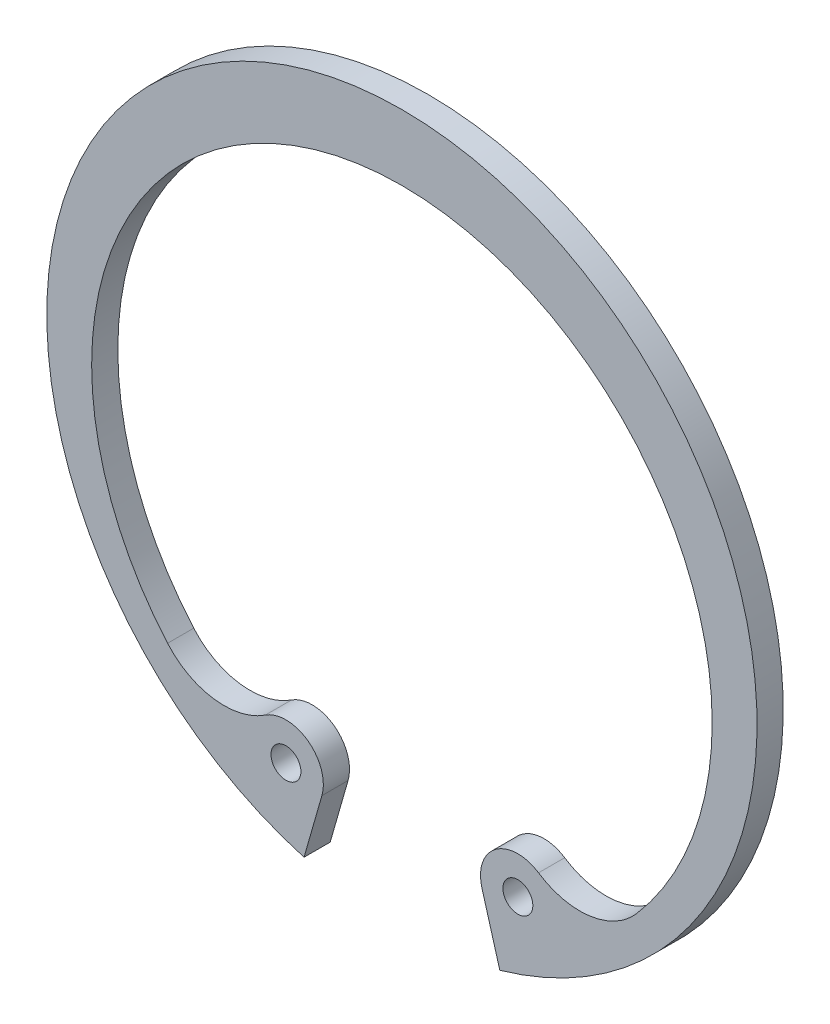
ISO-10303-21;
HEADER;
FILE_DESCRIPTION(('STEP AP214'),'2;1');
FILE_NAME('part.step','',(''),(''),'','','');
FILE_SCHEMA(('AUTOMOTIVE_DESIGN { 1 0 10303 214 1 1 1 1 }'));
ENDSEC;
DATA;
#1=APPLICATION_CONTEXT('core data for automotive mechanical design processes');
#2=APPLICATION_PROTOCOL_DEFINITION('international standard','automotive_design',2000,#1);
#3=PRODUCT_CONTEXT('',#1,'mechanical');
#4=PRODUCT('Part','Part','',(#3));
#5=PRODUCT_RELATED_PRODUCT_CATEGORY('part','',(#4));
#6=PRODUCT_DEFINITION_FORMATION('','',#4);
#7=PRODUCT_DEFINITION_CONTEXT('part definition',#1,'design');
#8=PRODUCT_DEFINITION('design','',#6,#7);
#9=PRODUCT_DEFINITION_SHAPE('','',#8);
#10=(LENGTH_UNIT() NAMED_UNIT(*) SI_UNIT(.MILLI.,.METRE.));
#11=(NAMED_UNIT(*) PLANE_ANGLE_UNIT() SI_UNIT($,.RADIAN.));
#12=(NAMED_UNIT(*) SI_UNIT($,.STERADIAN.) SOLID_ANGLE_UNIT());
#13=UNCERTAINTY_MEASURE_WITH_UNIT(LENGTH_MEASURE(1.E-05),#10,'distance_accuracy_value','');
#14=(GEOMETRIC_REPRESENTATION_CONTEXT(3) GLOBAL_UNCERTAINTY_ASSIGNED_CONTEXT((#13)) GLOBAL_UNIT_ASSIGNED_CONTEXT((#10,
#11,#12)) REPRESENTATION_CONTEXT('',''));
#15=CARTESIAN_POINT('',(0.,0.,0.));
#16=DIRECTION('',(0.,0.,1.));
#17=DIRECTION('',(1.,0.,0.));
#18=AXIS2_PLACEMENT_3D('',#15,#16,#17);
#19=CARTESIAN_POINT('',(-7.75514484056616,-17.9755159347105,1.75));
#20=DIRECTION('',(0.,0.,-1.));
#21=DIRECTION('',(-1.,0.,0.));
#22=AXIS2_PLACEMENT_3D('',#19,#20,#21);
#23=CYLINDRICAL_SURFACE('',#22,1.);
#24=CARTESIAN_POINT('',(-7.75514484056616,-17.9755159347105,1.75));
#25=DIRECTION('',(0.,0.,1.));
#26=DIRECTION('',(1.,0.,0.));
#27=AXIS2_PLACEMENT_3D('',#24,#25,#26);
#28=CIRCLE('',#27,1.);
#29=CARTESIAN_POINT('',(-6.75514484056616,-17.9755159347105,1.75));
#30=VERTEX_POINT('',#29);
#31=EDGE_CURVE('E190',#30,#30,#28,.T.);
#32=ORIENTED_EDGE('',*,*,#31,.T.);
#33=EDGE_LOOP('',(#32));
#34=FACE_BOUND('',#33,.T.);
#35=CARTESIAN_POINT('',(-7.75514484056616,-17.9755159347105,0.));
#36=DIRECTION('',(0.,0.,1.));
#37=DIRECTION('',(1.,0.,0.));
#38=AXIS2_PLACEMENT_3D('',#35,#36,#37);
#39=CIRCLE('',#38,1.);
#40=CARTESIAN_POINT('',(-6.75514484056616,-17.9755159347105,0.));
#41=VERTEX_POINT('',#40);
#42=EDGE_CURVE('E218',#41,#41,#39,.T.);
#43=ORIENTED_EDGE('',*,*,#42,.F.);
#44=EDGE_LOOP('',(#43));
#45=FACE_BOUND('',#44,.T.);
#46=ADVANCED_FACE('F97',(#34,#45),#23,.F.);
#47=CARTESIAN_POINT('',(0.,0.,0.));
#48=DIRECTION('',(0.,0.,1.));
#49=DIRECTION('',(1.,0.,0.));
#50=AXIS2_PLACEMENT_3D('',#47,#48,#49);
#51=PLANE('',#50);
#52=CARTESIAN_POINT('',(-7.75514484056616,-17.9755159347105,0.));
#53=DIRECTION('',(0.,0.,1.));
#54=DIRECTION('',(1.,0.,0.));
#55=AXIS2_PLACEMENT_3D('',#52,#53,#54);
#56=CIRCLE('',#55,2.5);
#57=CARTESIAN_POINT('',(-5.35199060072036,-18.664609324253,0.));
#58=VERTEX_POINT('',#57);
#59=CARTESIAN_POINT('',(-9.13541932338818,-15.8910873914232,0.));
#60=VERTEX_POINT('',#59);
#61=EDGE_CURVE('E174',#58,#60,#56,.T.);
#62=ORIENTED_EDGE('',*,*,#61,.F.);
#63=DIRECTION('',(-0.275637355817,-0.961261695938319,0.));
#64=VECTOR('',#63,1.);
#65=CARTESIAN_POINT('',(0.,0.,0.));
#66=LINE('',#65,#64);
#67=CARTESIAN_POINT('',(-6.54638720065374,-22.8299652785351,0.));
#68=VERTEX_POINT('',#67);
#69=EDGE_CURVE('E209',#58,#68,#66,.T.);
#70=ORIENTED_EDGE('',*,*,#69,.T.);
#71=CARTESIAN_POINT('',(0.,0.,0.));
#72=DIRECTION('',(0.,0.,1.));
#73=DIRECTION('',(1.,0.,0.));
#74=AXIS2_PLACEMENT_3D('',#71,#72,#73);
#75=CIRCLE('',#74,23.75);
#76=CARTESIAN_POINT('',(6.54638720065375,-22.8299652785351,0.));
#77=VERTEX_POINT('',#76);
#78=EDGE_CURVE('E206',#77,#68,#75,.T.);
#79=ORIENTED_EDGE('',*,*,#78,.F.);
#80=DIRECTION('',(0.275637355817,-0.961261695938319,0.));
#81=VECTOR('',#80,1.);
#82=CARTESIAN_POINT('',(0.,0.,0.));
#83=LINE('',#82,#81);
#84=CARTESIAN_POINT('',(5.35199060072037,-18.664609324253,0.));
#85=VERTEX_POINT('',#84);
#86=EDGE_CURVE('E204',#85,#77,#83,.T.);
#87=ORIENTED_EDGE('',*,*,#86,.F.);
#88=CARTESIAN_POINT('',(7.75514484056616,-17.9755159347105,0.));
#89=DIRECTION('',(0.,0.,1.));
#90=DIRECTION('',(1.,0.,0.));
#91=AXIS2_PLACEMENT_3D('',#88,#89,#90);
#92=CIRCLE('',#91,2.5);
#93=CARTESIAN_POINT('',(9.13541932338818,-15.8910873914232,0.));
#94=VERTEX_POINT('',#93);
#95=EDGE_CURVE('E201',#85,#94,#92,.F.);
#96=ORIENTED_EDGE('',*,*,#95,.T.);
#97=CARTESIAN_POINT('',(11.8959682890322,-11.7222303048488,0.));
#98=DIRECTION('',(0.,0.,1.));
#99=DIRECTION('',(1.,0.,0.));
#100=AXIS2_PLACEMENT_3D('',#97,#98,#99);
#101=CIRCLE('',#100,5.);
#102=CARTESIAN_POINT('',(15.6724661585663,-14.9991288143247,0.));
#103=VERTEX_POINT('',#102);
#104=EDGE_CURVE('E199',#103,#94,#101,.F.);
#105=ORIENTED_EDGE('',*,*,#104,.F.);
#106=CARTESIAN_POINT('',(0.,-1.4,0.));
#107=DIRECTION('',(0.,0.,1.));
#108=DIRECTION('',(1.,0.,0.));
#109=AXIS2_PLACEMENT_3D('',#106,#107,#108);
#110=CIRCLE('',#109,20.75);
#111=CARTESIAN_POINT('',(-15.6724661585663,-14.9991288143247,0.));
#112=VERTEX_POINT('',#111);
#113=EDGE_CURVE('E215',#103,#112,#110,.T.);
#114=ORIENTED_EDGE('',*,*,#113,.T.);
#115=CARTESIAN_POINT('',(-11.8959682890322,-11.7222303048488,0.));
#116=DIRECTION('',(0.,0.,1.));
#117=DIRECTION('',(1.,0.,0.));
#118=AXIS2_PLACEMENT_3D('',#115,#116,#117);
#119=CIRCLE('',#118,5.);
#120=EDGE_CURVE('E213',#112,#60,#119,.T.);
#121=ORIENTED_EDGE('',*,*,#120,.T.);
#122=EDGE_LOOP('',(#62,#70,#79,#87,#96,#105,#114,#121));
#123=FACE_BOUND('',#122,.T.);
#124=ORIENTED_EDGE('',*,*,#42,.T.);
#125=EDGE_LOOP('',(#124));
#126=FACE_BOUND('',#125,.T.);
#127=CARTESIAN_POINT('',(7.75514484056616,-17.9755159347105,0.));
#128=DIRECTION('',(0.,0.,1.));
#129=DIRECTION('',(1.,0.,0.));
#130=AXIS2_PLACEMENT_3D('',#127,#128,#129);
#131=CIRCLE('',#130,1.);
#132=CARTESIAN_POINT('',(8.75514484056616,-17.9755159347105,0.));
#133=VERTEX_POINT('',#132);
#134=EDGE_CURVE('E221',#133,#133,#131,.F.);
#135=ORIENTED_EDGE('',*,*,#134,.F.);
#136=EDGE_LOOP('',(#135));
#137=FACE_BOUND('',#136,.T.);
#138=ADVANCED_FACE('F242',(#123,#126,#137),#51,.F.);
#139=CARTESIAN_POINT('',(-7.75514484056616,-17.9755159347105,1.75));
#140=DIRECTION('',(0.,0.,-1.));
#141=DIRECTION('',(-1.,0.,0.));
#142=AXIS2_PLACEMENT_3D('',#139,#140,#141);
#143=CYLINDRICAL_SURFACE('',#142,2.5);
#144=ORIENTED_EDGE('',*,*,#61,.T.);
#145=DIRECTION('',(0.,0.,-1.));
#146=VECTOR('',#145,1.);
#147=CARTESIAN_POINT('',(-9.13541932338818,-15.8910873914232,1.75));
#148=LINE('',#147,#146);
#149=CARTESIAN_POINT('',(-9.13541932338818,-15.8910873914232,1.75));
#150=VERTEX_POINT('',#149);
#151=EDGE_CURVE('E168',#150,#60,#148,.T.);
#152=ORIENTED_EDGE('',*,*,#151,.F.);
#153=CARTESIAN_POINT('',(-7.75514484056616,-17.9755159347105,1.75));
#154=DIRECTION('',(0.,0.,1.));
#155=DIRECTION('',(1.,0.,0.));
#156=AXIS2_PLACEMENT_3D('',#153,#154,#155);
#157=CIRCLE('',#156,2.5);
#158=CARTESIAN_POINT('',(-5.35199060072036,-18.664609324253,1.75));
#159=VERTEX_POINT('',#158);
#160=EDGE_CURVE('E171',#159,#150,#157,.T.);
#161=ORIENTED_EDGE('',*,*,#160,.F.);
#162=DIRECTION('',(0.,0.,-1.));
#163=VECTOR('',#162,1.);
#164=CARTESIAN_POINT('',(-5.35199060072036,-18.664609324253,1.75));
#165=LINE('',#164,#163);
#166=EDGE_CURVE('E178',#159,#58,#165,.T.);
#167=ORIENTED_EDGE('',*,*,#166,.T.);
#168=EDGE_LOOP('',(#144,#152,#161,#167));
#169=FACE_BOUND('',#168,.T.);
#170=ADVANCED_FACE('F170',(#169),#143,.T.);
#171=CARTESIAN_POINT('',(0.,0.,1.75));
#172=DIRECTION('',(0.,0.,1.));
#173=DIRECTION('',(1.,0.,0.));
#174=AXIS2_PLACEMENT_3D('',#171,#172,#173);
#175=PLANE('',#174);
#176=ORIENTED_EDGE('',*,*,#160,.T.);
#177=CARTESIAN_POINT('',(-11.8959682890322,-11.7222303048488,1.75));
#178=DIRECTION('',(0.,0.,1.));
#179=DIRECTION('',(1.,0.,0.));
#180=AXIS2_PLACEMENT_3D('',#177,#178,#179);
#181=CIRCLE('',#180,5.);
#182=CARTESIAN_POINT('',(-15.6724661585663,-14.9991288143247,1.75));
#183=VERTEX_POINT('',#182);
#184=EDGE_CURVE('E183',#183,#150,#181,.T.);
#185=ORIENTED_EDGE('',*,*,#184,.F.);
#186=CARTESIAN_POINT('',(0.,-1.4,1.75));
#187=DIRECTION('',(0.,0.,1.));
#188=DIRECTION('',(1.,0.,0.));
#189=AXIS2_PLACEMENT_3D('',#186,#187,#188);
#190=CIRCLE('',#189,20.75);
#191=CARTESIAN_POINT('',(15.6724661585663,-14.9991288143247,1.75));
#192=VERTEX_POINT('',#191);
#193=EDGE_CURVE('E188',#192,#183,#190,.T.);
#194=ORIENTED_EDGE('',*,*,#193,.F.);
#195=CARTESIAN_POINT('',(11.8959682890322,-11.7222303048488,1.75));
#196=DIRECTION('',(0.,0.,1.));
#197=DIRECTION('',(1.,0.,0.));
#198=AXIS2_PLACEMENT_3D('',#195,#196,#197);
#199=CIRCLE('',#198,5.);
#200=CARTESIAN_POINT('',(9.13541932338818,-15.8910873914232,1.75));
#201=VERTEX_POINT('',#200);
#202=EDGE_CURVE('E151',#192,#201,#199,.F.);
#203=ORIENTED_EDGE('',*,*,#202,.T.);
#204=CARTESIAN_POINT('',(7.75514484056616,-17.9755159347105,1.75));
#205=DIRECTION('',(0.,0.,1.));
#206=DIRECTION('',(1.,0.,0.));
#207=AXIS2_PLACEMENT_3D('',#204,#205,#206);
#208=CIRCLE('',#207,2.5);
#209=CARTESIAN_POINT('',(5.35199060072037,-18.664609324253,1.75));
#210=VERTEX_POINT('',#209);
#211=EDGE_CURVE('E245',#210,#201,#208,.F.);
#212=ORIENTED_EDGE('',*,*,#211,.F.);
#213=DIRECTION('',(0.275637355817,-0.961261695938319,0.));
#214=VECTOR('',#213,1.);
#215=CARTESIAN_POINT('',(0.,0.,1.75));
#216=LINE('',#215,#214);
#217=CARTESIAN_POINT('',(6.54638720065375,-22.8299652785351,1.75));
#218=VERTEX_POINT('',#217);
#219=EDGE_CURVE('E236',#210,#218,#216,.T.);
#220=ORIENTED_EDGE('',*,*,#219,.T.);
#221=CARTESIAN_POINT('',(0.,0.,1.75));
#222=DIRECTION('',(0.,0.,1.));
#223=DIRECTION('',(1.,0.,0.));
#224=AXIS2_PLACEMENT_3D('',#221,#222,#223);
#225=CIRCLE('',#224,23.75);
#226=CARTESIAN_POINT('',(-6.54638720065374,-22.8299652785351,1.75));
#227=VERTEX_POINT('',#226);
#228=EDGE_CURVE('E337',#218,#227,#225,.T.);
#229=ORIENTED_EDGE('',*,*,#228,.T.);
#230=DIRECTION('',(-0.275637355817,-0.961261695938319,0.));
#231=VECTOR('',#230,1.);
#232=CARTESIAN_POINT('',(0.,0.,1.75));
#233=LINE('',#232,#231);
#234=EDGE_CURVE('E185',#159,#227,#233,.T.);
#235=ORIENTED_EDGE('',*,*,#234,.F.);
#236=EDGE_LOOP('',(#176,#185,#194,#203,#212,#220,#229,#235));
#237=FACE_BOUND('',#236,.T.);
#238=ORIENTED_EDGE('',*,*,#31,.F.);
#239=EDGE_LOOP('',(#238));
#240=FACE_BOUND('',#239,.T.);
#241=CARTESIAN_POINT('',(7.75514484056616,-17.9755159347105,1.75));
#242=DIRECTION('',(0.,0.,1.));
#243=DIRECTION('',(1.,0.,0.));
#244=AXIS2_PLACEMENT_3D('',#241,#242,#243);
#245=CIRCLE('',#244,1.);
#246=CARTESIAN_POINT('',(8.75514484056616,-17.9755159347105,1.75));
#247=VERTEX_POINT('',#246);
#248=EDGE_CURVE('E196',#247,#247,#245,.F.);
#249=ORIENTED_EDGE('',*,*,#248,.T.);
#250=EDGE_LOOP('',(#249));
#251=FACE_BOUND('',#250,.T.);
#252=ADVANCED_FACE('F181',(#237,#240,#251),#175,.T.);
#253=CARTESIAN_POINT('',(-11.8959682890322,-11.7222303048488,1.75));
#254=DIRECTION('',(0.,0.,-1.));
#255=DIRECTION('',(-1.,0.,0.));
#256=AXIS2_PLACEMENT_3D('',#253,#254,#255);
#257=CYLINDRICAL_SURFACE('',#256,5.);
#258=ORIENTED_EDGE('',*,*,#120,.F.);
#259=DIRECTION('',(0.,0.,-1.));
#260=VECTOR('',#259,1.);
#261=CARTESIAN_POINT('',(-15.6724661585663,-14.9991288143247,1.75));
#262=LINE('',#261,#260);
#263=EDGE_CURVE('E139',#183,#112,#262,.T.);
#264=ORIENTED_EDGE('',*,*,#263,.F.);
#265=ORIENTED_EDGE('',*,*,#184,.T.);
#266=ORIENTED_EDGE('',*,*,#151,.T.);
#267=EDGE_LOOP('',(#258,#264,#265,#266));
#268=FACE_BOUND('',#267,.T.);
#269=ADVANCED_FACE('F187',(#268),#257,.F.);
#270=CARTESIAN_POINT('',(0.,-1.4,1.75));
#271=DIRECTION('',(0.,0.,-1.));
#272=DIRECTION('',(-1.,0.,0.));
#273=AXIS2_PLACEMENT_3D('',#270,#271,#272);
#274=CYLINDRICAL_SURFACE('',#273,20.75);
#275=ORIENTED_EDGE('',*,*,#113,.F.);
#276=DIRECTION('',(0.,0.,-1.));
#277=VECTOR('',#276,1.);
#278=CARTESIAN_POINT('',(15.6724661585663,-14.9991288143247,1.75));
#279=LINE('',#278,#277);
#280=EDGE_CURVE('E114',#192,#103,#279,.T.);
#281=ORIENTED_EDGE('',*,*,#280,.F.);
#282=ORIENTED_EDGE('',*,*,#193,.T.);
#283=ORIENTED_EDGE('',*,*,#263,.T.);
#284=EDGE_LOOP('',(#275,#281,#282,#283));
#285=FACE_BOUND('',#284,.T.);
#286=ADVANCED_FACE('F246',(#285),#274,.F.);
#287=CARTESIAN_POINT('',(11.8959682890322,-11.7222303048488,1.75));
#288=DIRECTION('',(0.,0.,-1.));
#289=DIRECTION('',(-1.,0.,0.));
#290=AXIS2_PLACEMENT_3D('',#287,#288,#289);
#291=CYLINDRICAL_SURFACE('',#290,5.);
#292=ORIENTED_EDGE('',*,*,#104,.T.);
#293=DIRECTION('',(0.,0.,-1.));
#294=VECTOR('',#293,1.);
#295=CARTESIAN_POINT('',(9.13541932338818,-15.8910873914232,1.75));
#296=LINE('',#295,#294);
#297=EDGE_CURVE('E12',#201,#94,#296,.T.);
#298=ORIENTED_EDGE('',*,*,#297,.F.);
#299=ORIENTED_EDGE('',*,*,#202,.F.);
#300=ORIENTED_EDGE('',*,*,#280,.T.);
#301=EDGE_LOOP('',(#292,#298,#299,#300));
#302=FACE_BOUND('',#301,.T.);
#303=ADVANCED_FACE('F99',(#302),#291,.F.);
#304=CARTESIAN_POINT('',(7.75514484056616,-17.9755159347105,1.75));
#305=DIRECTION('',(0.,0.,-1.));
#306=DIRECTION('',(-1.,0.,0.));
#307=AXIS2_PLACEMENT_3D('',#304,#305,#306);
#308=CYLINDRICAL_SURFACE('',#307,2.5);
#309=ORIENTED_EDGE('',*,*,#95,.F.);
#310=DIRECTION('',(0.,0.,-1.));
#311=VECTOR('',#310,1.);
#312=CARTESIAN_POINT('',(5.35199060072037,-18.664609324253,1.75));
#313=LINE('',#312,#311);
#314=EDGE_CURVE('E106',#210,#85,#313,.T.);
#315=ORIENTED_EDGE('',*,*,#314,.F.);
#316=ORIENTED_EDGE('',*,*,#211,.T.);
#317=ORIENTED_EDGE('',*,*,#297,.T.);
#318=EDGE_LOOP('',(#309,#315,#316,#317));
#319=FACE_BOUND('',#318,.T.);
#320=ADVANCED_FACE('F244',(#319),#308,.T.);
#321=CARTESIAN_POINT('',(0.,0.,1.75));
#322=DIRECTION('',(0.961261695938319,0.275637355817,0.));
#323=DIRECTION('',(-0.275637355817,0.961261695938319,0.));
#324=AXIS2_PLACEMENT_3D('',#321,#322,#323);
#325=PLANE('',#324);
#326=ORIENTED_EDGE('',*,*,#86,.T.);
#327=DIRECTION('',(0.,0.,-1.));
#328=VECTOR('',#327,1.);
#329=CARTESIAN_POINT('',(6.54638720065375,-22.8299652785351,1.75));
#330=LINE('',#329,#328);
#331=EDGE_CURVE('E229',#218,#77,#330,.T.);
#332=ORIENTED_EDGE('',*,*,#331,.F.);
#333=ORIENTED_EDGE('',*,*,#219,.F.);
#334=ORIENTED_EDGE('',*,*,#314,.T.);
#335=EDGE_LOOP('',(#326,#332,#333,#334));
#336=FACE_BOUND('',#335,.T.);
#337=ADVANCED_FACE('F234',(#336),#325,.F.);
#338=CARTESIAN_POINT('',(0.,0.,1.75));
#339=DIRECTION('',(0.,0.,-1.));
#340=DIRECTION('',(-1.,0.,0.));
#341=AXIS2_PLACEMENT_3D('',#338,#339,#340);
#342=CYLINDRICAL_SURFACE('',#341,23.75);
#343=ORIENTED_EDGE('',*,*,#78,.T.);
#344=DIRECTION('',(0.,0.,-1.));
#345=VECTOR('',#344,1.);
#346=CARTESIAN_POINT('',(-6.54638720065374,-22.8299652785351,1.75));
#347=LINE('',#346,#345);
#348=EDGE_CURVE('E227',#227,#68,#347,.T.);
#349=ORIENTED_EDGE('',*,*,#348,.F.);
#350=ORIENTED_EDGE('',*,*,#228,.F.);
#351=ORIENTED_EDGE('',*,*,#331,.T.);
#352=EDGE_LOOP('',(#343,#349,#350,#351));
#353=FACE_BOUND('',#352,.T.);
#354=ADVANCED_FACE('F272',(#353),#342,.T.);
#355=CARTESIAN_POINT('',(0.,0.,1.75));
#356=DIRECTION('',(0.961261695938319,-0.275637355817,0.));
#357=DIRECTION('',(0.275637355817,0.961261695938319,0.));
#358=AXIS2_PLACEMENT_3D('',#355,#356,#357);
#359=PLANE('',#358);
#360=ORIENTED_EDGE('',*,*,#69,.F.);
#361=ORIENTED_EDGE('',*,*,#166,.F.);
#362=ORIENTED_EDGE('',*,*,#234,.T.);
#363=ORIENTED_EDGE('',*,*,#348,.T.);
#364=EDGE_LOOP('',(#360,#361,#362,#363));
#365=FACE_BOUND('',#364,.T.);
#366=ADVANCED_FACE('F267',(#365),#359,.T.);
#367=CARTESIAN_POINT('',(7.75514484056616,-17.9755159347105,1.75));
#368=DIRECTION('',(0.,0.,-1.));
#369=DIRECTION('',(-1.,0.,0.));
#370=AXIS2_PLACEMENT_3D('',#367,#368,#369);
#371=CYLINDRICAL_SURFACE('',#370,1.);
#372=ORIENTED_EDGE('',*,*,#248,.F.);
#373=EDGE_LOOP('',(#372));
#374=FACE_BOUND('',#373,.T.);
#375=ORIENTED_EDGE('',*,*,#134,.T.);
#376=EDGE_LOOP('',(#375));
#377=FACE_BOUND('',#376,.T.);
#378=ADVANCED_FACE('F265',(#374,#377),#371,.F.);
#379=CLOSED_SHELL('',(#46,#138,#170,#252,#269,#286,#303,#320,#337,#354,#366,#378));
#380=MANIFOLD_SOLID_BREP('B2',#379);
#381=ADVANCED_BREP_SHAPE_REPRESENTATION('',(#18,#380),#14);
#382=SHAPE_DEFINITION_REPRESENTATION(#9,#381);
ENDSEC;
END-ISO-10303-21;
